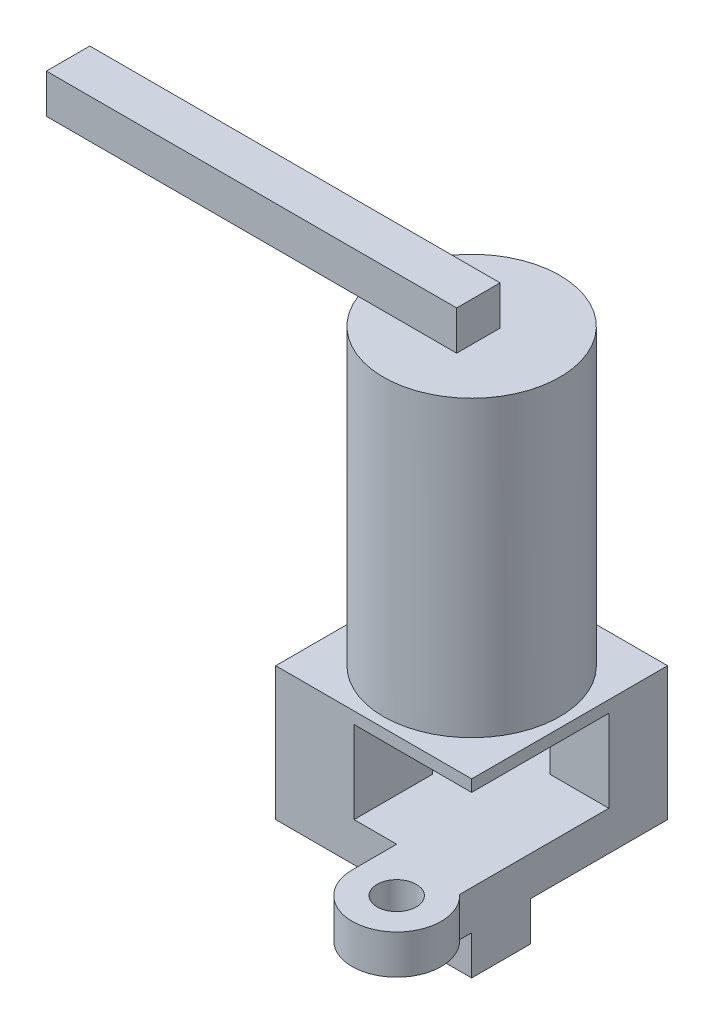
ISO-10303-21;
HEADER;
FILE_DESCRIPTION(('STEP AP214'),'2;1');
FILE_NAME('part.step','',(''),(''),'','','');
FILE_SCHEMA(('AUTOMOTIVE_DESIGN { 1 0 10303 214 1 1 1 1 }'));
ENDSEC;
DATA;
#1=APPLICATION_CONTEXT('core data for automotive mechanical design processes');
#2=APPLICATION_PROTOCOL_DEFINITION('international standard','automotive_design',2000,#1);
#3=PRODUCT_CONTEXT('',#1,'mechanical');
#4=PRODUCT('Part','Part','',(#3));
#5=PRODUCT_RELATED_PRODUCT_CATEGORY('part','',(#4));
#6=PRODUCT_DEFINITION_FORMATION('','',#4);
#7=PRODUCT_DEFINITION_CONTEXT('part definition',#1,'design');
#8=PRODUCT_DEFINITION('design','',#6,#7);
#9=PRODUCT_DEFINITION_SHAPE('','',#8);
#10=(LENGTH_UNIT() NAMED_UNIT(*) SI_UNIT(.MILLI.,.METRE.));
#11=(NAMED_UNIT(*) PLANE_ANGLE_UNIT() SI_UNIT($,.RADIAN.));
#12=(NAMED_UNIT(*) SI_UNIT($,.STERADIAN.) SOLID_ANGLE_UNIT());
#13=UNCERTAINTY_MEASURE_WITH_UNIT(LENGTH_MEASURE(1.E-05),#10,'distance_accuracy_value','');
#14=(GEOMETRIC_REPRESENTATION_CONTEXT(3) GLOBAL_UNCERTAINTY_ASSIGNED_CONTEXT((#13)) GLOBAL_UNIT_ASSIGNED_CONTEXT((#10,
#11,#12)) REPRESENTATION_CONTEXT('',''));
#15=CARTESIAN_POINT('',(0.,0.,0.));
#16=DIRECTION('',(0.,0.,1.));
#17=DIRECTION('',(1.,0.,0.));
#18=AXIS2_PLACEMENT_3D('',#15,#16,#17);
#19=CARTESIAN_POINT('',(42.2387696608268,10.,11.3627174683151));
#20=DIRECTION('',(0.,1.,0.));
#21=DIRECTION('',(0.,0.,1.));
#22=AXIS2_PLACEMENT_3D('',#19,#20,#21);
#23=PLANE('',#22);
#24=DIRECTION('',(0.723776357055051,0.,0.690034625919685));
#25=VECTOR('',#24,1.);
#26=CARTESIAN_POINT('',(3.43626604404177,10.,-40.4752499347023));
#27=LINE('',#26,#25);
#28=CARTESIAN_POINT('',(3.43626604404177,10.,-40.4752499347023));
#29=VERTEX_POINT('',#28);
#30=CARTESIAN_POINT('',(17.9342555580442,10.,-26.6531422168051));
#31=VERTEX_POINT('',#30);
#32=EDGE_CURVE('E380',#29,#31,#27,.T.);
#33=ORIENTED_EDGE('',*,*,#32,.F.);
#34=CARTESIAN_POINT('',(6.64626657364341,10.,-43.8422150146986));
#35=DIRECTION('',(0.,1.,0.));
#36=DIRECTION('',(0.,0.,1.));
#37=AXIS2_PLACEMENT_3D('',#34,#35,#36);
#38=CIRCLE('',#37,4.65194123457691);
#39=CARTESIAN_POINT('',(9.87465405870284,10.,-47.1915539787732));
#40=VERTEX_POINT('',#39);
#41=EDGE_CURVE('E378',#40,#29,#38,.T.);
#42=ORIENTED_EDGE('',*,*,#41,.F.);
#43=DIRECTION('',(-0.719987376276317,0.,-0.693987159825559));
#44=VECTOR('',#43,1.);
#45=CARTESIAN_POINT('',(9.87465405870284,10.,-47.1915539787732));
#46=LINE('',#45,#44);
#47=CARTESIAN_POINT('',(24.29674636625,10.,-33.2902729160126));
#48=VERTEX_POINT('',#47);
#49=EDGE_CURVE('E386',#48,#40,#46,.T.);
#50=ORIENTED_EDGE('',*,*,#49,.F.);
#51=CARTESIAN_POINT('',(21.1064158592592,10.,-29.9804167340048));
#52=DIRECTION('',(0.,1.,0.));
#53=DIRECTION('',(0.,0.,1.));
#54=AXIS2_PLACEMENT_3D('',#51,#52,#53);
#55=CIRCLE('',#54,4.5971030757871);
#56=EDGE_CURVE('E383',#31,#48,#55,.T.);
#57=ORIENTED_EDGE('',*,*,#56,.F.);
#58=EDGE_LOOP('',(#33,#42,#50,#57));
#59=FACE_BOUND('',#58,.T.);
#60=CARTESIAN_POINT('',(42.2387696608268,10.,11.3627174683151));
#61=DIRECTION('',(0.,1.,0.));
#62=DIRECTION('',(0.,0.,1.));
#63=AXIS2_PLACEMENT_3D('',#60,#61,#62);
#64=CIRCLE('',#63,5.);
#65=CARTESIAN_POINT('',(42.2387696608268,10.,16.3627174683151));
#66=VERTEX_POINT('',#65);
#67=EDGE_CURVE('E372',#66,#66,#64,.T.);
#68=ORIENTED_EDGE('',*,*,#67,.F.);
#69=EDGE_LOOP('',(#68));
#70=FACE_BOUND('',#69,.T.);
#71=DIRECTION('',(1.,0.,0.));
#72=VECTOR('',#71,1.);
#73=CARTESIAN_POINT('',(50.,10.,-35.));
#74=LINE('',#73,#72);
#75=CARTESIAN_POINT('',(35.,10.,-35.));
#76=VERTEX_POINT('',#75);
#77=CARTESIAN_POINT('',(50.,10.,-35.));
#78=VERTEX_POINT('',#77);
#79=EDGE_CURVE('E288',#76,#78,#74,.T.);
#80=ORIENTED_EDGE('',*,*,#79,.F.);
#81=DIRECTION('',(0.,0.,1.));
#82=VECTOR('',#81,1.);
#83=CARTESIAN_POINT('',(35.,10.,-50.));
#84=LINE('',#83,#82);
#85=CARTESIAN_POINT('',(35.,10.,-50.));
#86=VERTEX_POINT('',#85);
#87=EDGE_CURVE('E283',#86,#76,#84,.T.);
#88=ORIENTED_EDGE('',*,*,#87,.F.);
#89=DIRECTION('',(-1.,0.,0.));
#90=VECTOR('',#89,1.);
#91=CARTESIAN_POINT('',(0.,10.,-50.));
#92=LINE('',#91,#90);
#93=CARTESIAN_POINT('',(0.,10.,-50.));
#94=VERTEX_POINT('',#93);
#95=EDGE_CURVE('E420',#86,#94,#92,.T.);
#96=ORIENTED_EDGE('',*,*,#95,.T.);
#97=DIRECTION('',(0.,0.,1.));
#98=VECTOR('',#97,1.);
#99=CARTESIAN_POINT('',(0.,10.,0.));
#100=LINE('',#99,#98);
#101=CARTESIAN_POINT('',(0.,10.,-20.));
#102=VERTEX_POINT('',#101);
#103=EDGE_CURVE('E409',#94,#102,#100,.T.);
#104=ORIENTED_EDGE('',*,*,#103,.T.);
#105=DIRECTION('',(-1.,0.,0.));
#106=VECTOR('',#105,1.);
#107=CARTESIAN_POINT('',(0.,10.,-20.));
#108=LINE('',#107,#106);
#109=CARTESIAN_POINT('',(20.,10.,-20.));
#110=VERTEX_POINT('',#109);
#111=EDGE_CURVE('E309',#110,#102,#108,.T.);
#112=ORIENTED_EDGE('',*,*,#111,.F.);
#113=DIRECTION('',(0.,0.,-1.));
#114=VECTOR('',#113,1.);
#115=CARTESIAN_POINT('',(20.,10.,0.));
#116=LINE('',#115,#114);
#117=CARTESIAN_POINT('',(20.,10.,0.));
#118=VERTEX_POINT('',#117);
#119=EDGE_CURVE('E304',#118,#110,#116,.T.);
#120=ORIENTED_EDGE('',*,*,#119,.F.);
#121=DIRECTION('',(1.,0.,0.));
#122=VECTOR('',#121,1.);
#123=CARTESIAN_POINT('',(0.,10.,0.));
#124=LINE('',#123,#122);
#125=CARTESIAN_POINT('',(30.8760521925118,10.,0.));
#126=VERTEX_POINT('',#125);
#127=EDGE_CURVE('E411',#118,#126,#124,.T.);
#128=ORIENTED_EDGE('',*,*,#127,.T.);
#129=DIRECTION('',(0.,0.,1.));
#130=VECTOR('',#129,1.);
#131=CARTESIAN_POINT('',(30.8760521925118,10.,11.3627174683151));
#132=LINE('',#131,#130);
#133=CARTESIAN_POINT('',(30.8760521925118,10.,11.3627174683151));
#134=VERTEX_POINT('',#133);
#135=EDGE_CURVE('E414',#126,#134,#132,.T.);
#136=ORIENTED_EDGE('',*,*,#135,.T.);
#137=CARTESIAN_POINT('',(42.2387696608268,10.,11.3627174683151));
#138=DIRECTION('',(0.,1.,0.));
#139=DIRECTION('',(0.,0.,1.));
#140=AXIS2_PLACEMENT_3D('',#137,#138,#139);
#141=CIRCLE('',#140,11.3627174683151);
#142=CARTESIAN_POINT('',(50.,10.,3.06364210493568));
#143=VERTEX_POINT('',#142);
#144=EDGE_CURVE('E416',#134,#143,#141,.T.);
#145=ORIENTED_EDGE('',*,*,#144,.T.);
#146=DIRECTION('',(0.,0.,-1.));
#147=VECTOR('',#146,1.);
#148=CARTESIAN_POINT('',(50.,10.,0.));
#149=LINE('',#148,#147);
#150=EDGE_CURVE('E418',#143,#78,#149,.T.);
#151=ORIENTED_EDGE('',*,*,#150,.T.);
#152=EDGE_LOOP('',(#80,#88,#96,#104,#112,#120,#128,#136,#145,#151));
#153=FACE_BOUND('',#152,.T.);
#154=ADVANCED_FACE('F33',(#59,#70,#153),#23,.T.);
#155=CARTESIAN_POINT('',(42.2387696608268,0.,11.3627174683151));
#156=DIRECTION('',(0.,1.,0.));
#157=DIRECTION('',(0.,0.,1.));
#158=AXIS2_PLACEMENT_3D('',#155,#156,#157);
#159=PLANE('',#158);
#160=CARTESIAN_POINT('',(42.2387696608268,0.,11.3627174683151));
#161=DIRECTION('',(0.,1.,0.));
#162=DIRECTION('',(0.,0.,1.));
#163=AXIS2_PLACEMENT_3D('',#160,#161,#162);
#164=CIRCLE('',#163,5.);
#165=CARTESIAN_POINT('',(42.2387696608268,0.,16.3627174683151));
#166=VERTEX_POINT('',#165);
#167=EDGE_CURVE('E371',#166,#166,#164,.T.);
#168=ORIENTED_EDGE('',*,*,#167,.T.);
#169=EDGE_LOOP('',(#168));
#170=FACE_BOUND('',#169,.T.);
#171=CARTESIAN_POINT('',(6.64626657364341,0.,-43.8422150146986));
#172=DIRECTION('',(0.,1.,0.));
#173=DIRECTION('',(0.,0.,1.));
#174=AXIS2_PLACEMENT_3D('',#171,#172,#173);
#175=CIRCLE('',#174,4.65194123457691);
#176=CARTESIAN_POINT('',(9.87465405870284,0.,-47.1915539787733));
#177=VERTEX_POINT('',#176);
#178=CARTESIAN_POINT('',(3.43626604404177,0.,-40.4752499347023));
#179=VERTEX_POINT('',#178);
#180=EDGE_CURVE('E375',#177,#179,#175,.T.);
#181=ORIENTED_EDGE('',*,*,#180,.T.);
#182=DIRECTION('',(0.723776357055051,0.,0.690034625919685));
#183=VECTOR('',#182,1.);
#184=CARTESIAN_POINT('',(3.43626604404177,0.,-40.4752499347023));
#185=LINE('',#184,#183);
#186=CARTESIAN_POINT('',(17.9342555580442,0.,-26.6531422168051));
#187=VERTEX_POINT('',#186);
#188=EDGE_CURVE('E391',#179,#187,#185,.T.);
#189=ORIENTED_EDGE('',*,*,#188,.T.);
#190=CARTESIAN_POINT('',(21.1064158592592,0.,-29.9804167340048));
#191=DIRECTION('',(0.,1.,0.));
#192=DIRECTION('',(0.,0.,1.));
#193=AXIS2_PLACEMENT_3D('',#190,#191,#192);
#194=CIRCLE('',#193,4.5971030757871);
#195=CARTESIAN_POINT('',(24.29674636625,0.,-33.2902729160126));
#196=VERTEX_POINT('',#195);
#197=EDGE_CURVE('E394',#187,#196,#194,.T.);
#198=ORIENTED_EDGE('',*,*,#197,.T.);
#199=DIRECTION('',(-0.719987376276317,0.,-0.693987159825559));
#200=VECTOR('',#199,1.);
#201=CARTESIAN_POINT('',(9.87465405870284,0.,-47.1915539787732));
#202=LINE('',#201,#200);
#203=EDGE_CURVE('E381',#196,#177,#202,.T.);
#204=ORIENTED_EDGE('',*,*,#203,.T.);
#205=EDGE_LOOP('',(#181,#189,#198,#204));
#206=FACE_BOUND('',#205,.T.);
#207=DIRECTION('',(-1.,0.,0.));
#208=VECTOR('',#207,1.);
#209=CARTESIAN_POINT('',(50.,0.,0.));
#210=LINE('',#209,#208);
#211=CARTESIAN_POINT('',(50.,0.,0.));
#212=VERTEX_POINT('',#211);
#213=CARTESIAN_POINT('',(35.,0.,0.));
#214=VERTEX_POINT('',#213);
#215=EDGE_CURVE('E325',#212,#214,#210,.T.);
#216=ORIENTED_EDGE('',*,*,#215,.F.);
#217=DIRECTION('',(0.,0.,-1.));
#218=VECTOR('',#217,1.);
#219=CARTESIAN_POINT('',(50.,0.,0.));
#220=LINE('',#219,#218);
#221=CARTESIAN_POINT('',(50.,0.,3.06364210493568));
#222=VERTEX_POINT('',#221);
#223=EDGE_CURVE('E433',#222,#212,#220,.T.);
#224=ORIENTED_EDGE('',*,*,#223,.F.);
#225=CARTESIAN_POINT('',(42.2387696608268,0.,11.3627174683151));
#226=DIRECTION('',(0.,1.,0.));
#227=DIRECTION('',(0.,0.,1.));
#228=AXIS2_PLACEMENT_3D('',#225,#226,#227);
#229=CIRCLE('',#228,11.3627174683151);
#230=CARTESIAN_POINT('',(30.8760521925118,0.,11.3627174683151));
#231=VERTEX_POINT('',#230);
#232=EDGE_CURVE('E429',#231,#222,#229,.T.);
#233=ORIENTED_EDGE('',*,*,#232,.F.);
#234=DIRECTION('',(0.,0.,1.));
#235=VECTOR('',#234,1.);
#236=CARTESIAN_POINT('',(30.8760521925118,0.,11.3627174683151));
#237=LINE('',#236,#235);
#238=CARTESIAN_POINT('',(30.8760521925118,0.,0.));
#239=VERTEX_POINT('',#238);
#240=EDGE_CURVE('E427',#239,#231,#237,.T.);
#241=ORIENTED_EDGE('',*,*,#240,.F.);
#242=DIRECTION('',(1.,0.,0.));
#243=VECTOR('',#242,1.);
#244=CARTESIAN_POINT('',(0.,0.,0.));
#245=LINE('',#244,#243);
#246=CARTESIAN_POINT('',(0.,0.,0.));
#247=VERTEX_POINT('',#246);
#248=EDGE_CURVE('E425',#247,#239,#245,.T.);
#249=ORIENTED_EDGE('',*,*,#248,.F.);
#250=DIRECTION('',(0.,0.,1.));
#251=VECTOR('',#250,1.);
#252=CARTESIAN_POINT('',(0.,0.,0.));
#253=LINE('',#252,#251);
#254=CARTESIAN_POINT('',(0.,0.,-50.));
#255=VERTEX_POINT('',#254);
#256=EDGE_CURVE('E408',#255,#247,#253,.T.);
#257=ORIENTED_EDGE('',*,*,#256,.F.);
#258=DIRECTION('',(-1.,0.,0.));
#259=VECTOR('',#258,1.);
#260=CARTESIAN_POINT('',(0.,0.,-50.));
#261=LINE('',#260,#259);
#262=CARTESIAN_POINT('',(50.,0.,-50.));
#263=VERTEX_POINT('',#262);
#264=EDGE_CURVE('E412',#263,#255,#261,.T.);
#265=ORIENTED_EDGE('',*,*,#264,.F.);
#266=CARTESIAN_POINT('',(50.,0.,-15.));
#267=VERTEX_POINT('',#266);
#268=EDGE_CURVE('E432',#267,#263,#220,.T.);
#269=ORIENTED_EDGE('',*,*,#268,.F.);
#270=DIRECTION('',(1.,0.,0.));
#271=VECTOR('',#270,1.);
#272=CARTESIAN_POINT('',(50.,0.,-15.));
#273=LINE('',#272,#271);
#274=CARTESIAN_POINT('',(45.,0.,-15.));
#275=VERTEX_POINT('',#274);
#276=EDGE_CURVE('E330',#275,#267,#273,.T.);
#277=ORIENTED_EDGE('',*,*,#276,.F.);
#278=DIRECTION('',(0.,0.,-1.));
#279=VECTOR('',#278,1.);
#280=CARTESIAN_POINT('',(45.,0.,-5.));
#281=LINE('',#280,#279);
#282=CARTESIAN_POINT('',(45.,0.,-5.));
#283=VERTEX_POINT('',#282);
#284=EDGE_CURVE('E349',#283,#275,#281,.T.);
#285=ORIENTED_EDGE('',*,*,#284,.F.);
#286=DIRECTION('',(1.,0.,0.));
#287=VECTOR('',#286,1.);
#288=CARTESIAN_POINT('',(45.,0.,-5.));
#289=LINE('',#288,#287);
#290=CARTESIAN_POINT('',(35.,0.,-5.));
#291=VERTEX_POINT('',#290);
#292=EDGE_CURVE('E346',#291,#283,#289,.T.);
#293=ORIENTED_EDGE('',*,*,#292,.F.);
#294=DIRECTION('',(0.,0.,-1.));
#295=VECTOR('',#294,1.);
#296=CARTESIAN_POINT('',(35.,0.,0.));
#297=LINE('',#296,#295);
#298=EDGE_CURVE('E343',#214,#291,#297,.T.);
#299=ORIENTED_EDGE('',*,*,#298,.F.);
#300=EDGE_LOOP('',(#216,#224,#233,#241,#249,#257,#265,#269,#277,#285,#293,#299));
#301=FACE_BOUND('',#300,.T.);
#302=ADVANCED_FACE('F465',(#170,#206,#301),#159,.F.);
#303=CARTESIAN_POINT('',(0.,10.,0.));
#304=DIRECTION('',(1.,0.,0.));
#305=DIRECTION('',(0.,0.,-1.));
#306=AXIS2_PLACEMENT_3D('',#303,#304,#305);
#307=PLANE('',#306);
#308=ORIENTED_EDGE('',*,*,#256,.T.);
#309=DIRECTION('',(0.,-1.,0.));
#310=VECTOR('',#309,1.);
#311=CARTESIAN_POINT('',(0.,10.,0.));
#312=LINE('',#311,#310);
#313=CARTESIAN_POINT('',(0.,34.,0.));
#314=VERTEX_POINT('',#313);
#315=EDGE_CURVE('E37',#314,#247,#312,.T.);
#316=ORIENTED_EDGE('',*,*,#315,.F.);
#317=DIRECTION('',(0.,0.,1.));
#318=VECTOR('',#317,1.);
#319=CARTESIAN_POINT('',(0.,34.,0.));
#320=LINE('',#319,#318);
#321=CARTESIAN_POINT('',(0.,34.,-50.));
#322=VERTEX_POINT('',#321);
#323=EDGE_CURVE('E258',#322,#314,#320,.T.);
#324=ORIENTED_EDGE('',*,*,#323,.F.);
#325=DIRECTION('',(0.,-1.,0.));
#326=VECTOR('',#325,1.);
#327=CARTESIAN_POINT('',(0.,34.,-50.));
#328=LINE('',#327,#326);
#329=CARTESIAN_POINT('',(0.,31.,-50.));
#330=VERTEX_POINT('',#329);
#331=EDGE_CURVE('E269',#322,#330,#328,.T.);
#332=ORIENTED_EDGE('',*,*,#331,.T.);
#333=DIRECTION('',(0.,0.,1.));
#334=VECTOR('',#333,1.);
#335=CARTESIAN_POINT('',(0.,31.,0.));
#336=LINE('',#335,#334);
#337=CARTESIAN_POINT('',(0.,31.,-20.));
#338=VERTEX_POINT('',#337);
#339=EDGE_CURVE('E255',#330,#338,#336,.T.);
#340=ORIENTED_EDGE('',*,*,#339,.T.);
#341=DIRECTION('',(0.,-1.,0.));
#342=VECTOR('',#341,1.);
#343=CARTESIAN_POINT('',(0.,31.,-20.));
#344=LINE('',#343,#342);
#345=EDGE_CURVE('E312',#338,#102,#344,.T.);
#346=ORIENTED_EDGE('',*,*,#345,.T.);
#347=ORIENTED_EDGE('',*,*,#103,.F.);
#348=DIRECTION('',(0.,-1.,0.));
#349=VECTOR('',#348,1.);
#350=CARTESIAN_POINT('',(0.,10.,-50.));
#351=LINE('',#350,#349);
#352=EDGE_CURVE('E422',#94,#255,#351,.T.);
#353=ORIENTED_EDGE('',*,*,#352,.T.);
#354=EDGE_LOOP('',(#308,#316,#324,#332,#340,#346,#347,#353));
#355=FACE_BOUND('',#354,.T.);
#356=ADVANCED_FACE('F35',(#355),#307,.F.);
#357=CARTESIAN_POINT('',(0.,10.,0.));
#358=DIRECTION('',(0.,0.,-1.));
#359=DIRECTION('',(-1.,0.,0.));
#360=AXIS2_PLACEMENT_3D('',#357,#358,#359);
#361=PLANE('',#360);
#362=ORIENTED_EDGE('',*,*,#248,.T.);
#363=DIRECTION('',(0.,-1.,0.));
#364=VECTOR('',#363,1.);
#365=CARTESIAN_POINT('',(30.8760521925118,10.,0.));
#366=LINE('',#365,#364);
#367=EDGE_CURVE('E447',#126,#239,#366,.T.);
#368=ORIENTED_EDGE('',*,*,#367,.F.);
#369=ORIENTED_EDGE('',*,*,#127,.F.);
#370=DIRECTION('',(0.,-1.,0.));
#371=VECTOR('',#370,1.);
#372=CARTESIAN_POINT('',(20.,31.,0.));
#373=LINE('',#372,#371);
#374=CARTESIAN_POINT('',(20.,31.,0.));
#375=VERTEX_POINT('',#374);
#376=EDGE_CURVE('E322',#375,#118,#373,.T.);
#377=ORIENTED_EDGE('',*,*,#376,.F.);
#378=DIRECTION('',(1.,0.,0.));
#379=VECTOR('',#378,1.);
#380=CARTESIAN_POINT('',(0.,31.,0.));
#381=LINE('',#380,#379);
#382=CARTESIAN_POINT('',(50.,31.,0.));
#383=VERTEX_POINT('',#382);
#384=EDGE_CURVE('E272',#375,#383,#381,.T.);
#385=ORIENTED_EDGE('',*,*,#384,.T.);
#386=DIRECTION('',(0.,-1.,0.));
#387=VECTOR('',#386,1.);
#388=CARTESIAN_POINT('',(50.,34.,0.));
#389=LINE('',#388,#387);
#390=CARTESIAN_POINT('',(50.,34.,0.));
#391=VERTEX_POINT('',#390);
#392=EDGE_CURVE('E280',#391,#383,#389,.T.);
#393=ORIENTED_EDGE('',*,*,#392,.F.);
#394=DIRECTION('',(1.,0.,0.));
#395=VECTOR('',#394,1.);
#396=CARTESIAN_POINT('',(0.,34.,0.));
#397=LINE('',#396,#395);
#398=EDGE_CURVE('E261',#314,#391,#397,.T.);
#399=ORIENTED_EDGE('',*,*,#398,.F.);
#400=ORIENTED_EDGE('',*,*,#315,.T.);
#401=EDGE_LOOP('',(#362,#368,#369,#377,#385,#393,#399,#400));
#402=FACE_BOUND('',#401,.T.);
#403=ADVANCED_FACE('F456',(#402),#361,.F.);
#404=CARTESIAN_POINT('',(30.8760521925118,10.,11.3627174683151));
#405=DIRECTION('',(1.,0.,0.));
#406=DIRECTION('',(0.,0.,-1.));
#407=AXIS2_PLACEMENT_3D('',#404,#405,#406);
#408=PLANE('',#407);
#409=ORIENTED_EDGE('',*,*,#240,.T.);
#410=DIRECTION('',(0.,-1.,0.));
#411=VECTOR('',#410,1.);
#412=CARTESIAN_POINT('',(30.8760521925118,10.,11.3627174683151));
#413=LINE('',#412,#411);
#414=EDGE_CURVE('E445',#134,#231,#413,.T.);
#415=ORIENTED_EDGE('',*,*,#414,.F.);
#416=ORIENTED_EDGE('',*,*,#135,.F.);
#417=ORIENTED_EDGE('',*,*,#367,.T.);
#418=EDGE_LOOP('',(#409,#415,#416,#417));
#419=FACE_BOUND('',#418,.T.);
#420=ADVANCED_FACE('F468',(#419),#408,.F.);
#421=CARTESIAN_POINT('',(42.2387696608268,10.,11.3627174683151));
#422=DIRECTION('',(0.,-1.,0.));
#423=DIRECTION('',(0.,0.,-1.));
#424=AXIS2_PLACEMENT_3D('',#421,#422,#423);
#425=CYLINDRICAL_SURFACE('',#424,11.3627174683151);
#426=ORIENTED_EDGE('',*,*,#232,.T.);
#427=DIRECTION('',(0.,-1.,0.));
#428=VECTOR('',#427,1.);
#429=CARTESIAN_POINT('',(50.,10.,3.06364210493568));
#430=LINE('',#429,#428);
#431=EDGE_CURVE('E442',#143,#222,#430,.T.);
#432=ORIENTED_EDGE('',*,*,#431,.F.);
#433=ORIENTED_EDGE('',*,*,#144,.F.);
#434=ORIENTED_EDGE('',*,*,#414,.T.);
#435=EDGE_LOOP('',(#426,#432,#433,#434));
#436=FACE_BOUND('',#435,.T.);
#437=ADVANCED_FACE('F471',(#436),#425,.T.);
#438=CARTESIAN_POINT('',(50.,10.,0.));
#439=DIRECTION('',(-1.,0.,0.));
#440=DIRECTION('',(0.,0.,1.));
#441=AXIS2_PLACEMENT_3D('',#438,#439,#440);
#442=PLANE('',#441);
#443=ORIENTED_EDGE('',*,*,#223,.T.);
#444=DIRECTION('',(0.,1.,0.));
#445=VECTOR('',#444,1.);
#446=CARTESIAN_POINT('',(50.,-10.,0.));
#447=LINE('',#446,#445);
#448=CARTESIAN_POINT('',(50.,-10.,0.));
#449=VERTEX_POINT('',#448);
#450=EDGE_CURVE('E340',#449,#212,#447,.T.);
#451=ORIENTED_EDGE('',*,*,#450,.F.);
#452=DIRECTION('',(0.,0.,1.));
#453=VECTOR('',#452,1.);
#454=CARTESIAN_POINT('',(50.,-10.,-15.));
#455=LINE('',#454,#453);
#456=CARTESIAN_POINT('',(50.,-10.,-15.));
#457=VERTEX_POINT('',#456);
#458=EDGE_CURVE('E338',#457,#449,#455,.T.);
#459=ORIENTED_EDGE('',*,*,#458,.F.);
#460=DIRECTION('',(0.,1.,0.));
#461=VECTOR('',#460,1.);
#462=CARTESIAN_POINT('',(50.,-10.,-15.));
#463=LINE('',#462,#461);
#464=EDGE_CURVE('E356',#457,#267,#463,.T.);
#465=ORIENTED_EDGE('',*,*,#464,.T.);
#466=ORIENTED_EDGE('',*,*,#268,.T.);
#467=DIRECTION('',(0.,-1.,0.));
#468=VECTOR('',#467,1.);
#469=CARTESIAN_POINT('',(50.,10.,-50.));
#470=LINE('',#469,#468);
#471=CARTESIAN_POINT('',(50.,34.,-50.));
#472=VERTEX_POINT('',#471);
#473=EDGE_CURVE('E439',#472,#263,#470,.T.);
#474=ORIENTED_EDGE('',*,*,#473,.F.);
#475=DIRECTION('',(0.,0.,-1.));
#476=VECTOR('',#475,1.);
#477=CARTESIAN_POINT('',(50.,34.,0.));
#478=LINE('',#477,#476);
#479=EDGE_CURVE('E264',#391,#472,#478,.T.);
#480=ORIENTED_EDGE('',*,*,#479,.F.);
#481=ORIENTED_EDGE('',*,*,#392,.T.);
#482=DIRECTION('',(0.,0.,-1.));
#483=VECTOR('',#482,1.);
#484=CARTESIAN_POINT('',(50.,31.,0.));
#485=LINE('',#484,#483);
#486=CARTESIAN_POINT('',(50.,31.,-35.));
#487=VERTEX_POINT('',#486);
#488=EDGE_CURVE('E274',#383,#487,#485,.T.);
#489=ORIENTED_EDGE('',*,*,#488,.T.);
#490=DIRECTION('',(0.,-1.,0.));
#491=VECTOR('',#490,1.);
#492=CARTESIAN_POINT('',(50.,31.,-35.));
#493=LINE('',#492,#491);
#494=EDGE_CURVE('E291',#487,#78,#493,.T.);
#495=ORIENTED_EDGE('',*,*,#494,.T.);
#496=ORIENTED_EDGE('',*,*,#150,.F.);
#497=ORIENTED_EDGE('',*,*,#431,.T.);
#498=EDGE_LOOP('',(#443,#451,#459,#465,#466,#474,#480,#481,#489,#495,#496,#497));
#499=FACE_BOUND('',#498,.T.);
#500=ADVANCED_FACE('F486',(#499),#442,.F.);
#501=CARTESIAN_POINT('',(0.,10.,-50.));
#502=DIRECTION('',(0.,0.,1.));
#503=DIRECTION('',(1.,0.,0.));
#504=AXIS2_PLACEMENT_3D('',#501,#502,#503);
#505=PLANE('',#504);
#506=ORIENTED_EDGE('',*,*,#264,.T.);
#507=ORIENTED_EDGE('',*,*,#352,.F.);
#508=ORIENTED_EDGE('',*,*,#95,.F.);
#509=DIRECTION('',(0.,-1.,0.));
#510=VECTOR('',#509,1.);
#511=CARTESIAN_POINT('',(35.,31.,-50.));
#512=LINE('',#511,#510);
#513=CARTESIAN_POINT('',(35.,31.,-50.));
#514=VERTEX_POINT('',#513);
#515=EDGE_CURVE('E301',#514,#86,#512,.T.);
#516=ORIENTED_EDGE('',*,*,#515,.F.);
#517=DIRECTION('',(-1.,0.,0.));
#518=VECTOR('',#517,1.);
#519=CARTESIAN_POINT('',(0.,31.,-50.));
#520=LINE('',#519,#518);
#521=EDGE_CURVE('E262',#514,#330,#520,.T.);
#522=ORIENTED_EDGE('',*,*,#521,.T.);
#523=ORIENTED_EDGE('',*,*,#331,.F.);
#524=DIRECTION('',(-1.,0.,0.));
#525=VECTOR('',#524,1.);
#526=CARTESIAN_POINT('',(0.,34.,-50.));
#527=LINE('',#526,#525);
#528=EDGE_CURVE('E267',#472,#322,#527,.T.);
#529=ORIENTED_EDGE('',*,*,#528,.F.);
#530=ORIENTED_EDGE('',*,*,#473,.T.);
#531=EDGE_LOOP('',(#506,#507,#508,#516,#522,#523,#529,#530));
#532=FACE_BOUND('',#531,.T.);
#533=ADVANCED_FACE('F492',(#532),#505,.F.);
#534=CARTESIAN_POINT('',(6.64626657364341,10.,-43.8422150146986));
#535=DIRECTION('',(0.,-1.,0.));
#536=DIRECTION('',(0.,0.,-1.));
#537=AXIS2_PLACEMENT_3D('',#534,#535,#536);
#538=CYLINDRICAL_SURFACE('',#537,4.65194123457691);
#539=ORIENTED_EDGE('',*,*,#180,.F.);
#540=DIRECTION('',(0.,-1.,0.));
#541=VECTOR('',#540,1.);
#542=CARTESIAN_POINT('',(9.87465405870284,10.,-47.1915539787732));
#543=LINE('',#542,#541);
#544=EDGE_CURVE('E388',#40,#177,#543,.T.);
#545=ORIENTED_EDGE('',*,*,#544,.F.);
#546=ORIENTED_EDGE('',*,*,#41,.T.);
#547=DIRECTION('',(0.,-1.,0.));
#548=VECTOR('',#547,1.);
#549=CARTESIAN_POINT('',(3.43626604404177,10.,-40.4752499347023));
#550=LINE('',#549,#548);
#551=EDGE_CURVE('E405',#29,#179,#550,.T.);
#552=ORIENTED_EDGE('',*,*,#551,.T.);
#553=EDGE_LOOP('',(#539,#545,#546,#552));
#554=FACE_BOUND('',#553,.T.);
#555=ADVANCED_FACE('F547',(#554),#538,.F.);
#556=CARTESIAN_POINT('',(3.43626604404177,10.,-40.4752499347023));
#557=DIRECTION('',(0.690034625919685,0.,-0.723776357055051));
#558=DIRECTION('',(-0.723776357055051,0.,-0.690034625919685));
#559=AXIS2_PLACEMENT_3D('',#556,#557,#558);
#560=PLANE('',#559);
#561=ORIENTED_EDGE('',*,*,#188,.F.);
#562=ORIENTED_EDGE('',*,*,#551,.F.);
#563=ORIENTED_EDGE('',*,*,#32,.T.);
#564=DIRECTION('',(0.,-1.,0.));
#565=VECTOR('',#564,1.);
#566=CARTESIAN_POINT('',(17.9342555580442,10.,-26.6531422168051));
#567=LINE('',#566,#565);
#568=EDGE_CURVE('E403',#31,#187,#567,.T.);
#569=ORIENTED_EDGE('',*,*,#568,.T.);
#570=EDGE_LOOP('',(#561,#562,#563,#569));
#571=FACE_BOUND('',#570,.T.);
#572=ADVANCED_FACE('F825',(#571),#560,.T.);
#573=CARTESIAN_POINT('',(21.1064158592592,10.,-29.9804167340048));
#574=DIRECTION('',(0.,-1.,0.));
#575=DIRECTION('',(0.,0.,-1.));
#576=AXIS2_PLACEMENT_3D('',#573,#574,#575);
#577=CYLINDRICAL_SURFACE('',#576,4.5971030757871);
#578=ORIENTED_EDGE('',*,*,#197,.F.);
#579=ORIENTED_EDGE('',*,*,#568,.F.);
#580=ORIENTED_EDGE('',*,*,#56,.T.);
#581=DIRECTION('',(0.,-1.,0.));
#582=VECTOR('',#581,1.);
#583=CARTESIAN_POINT('',(24.29674636625,10.,-33.2902729160126));
#584=LINE('',#583,#582);
#585=EDGE_CURVE('E401',#48,#196,#584,.T.);
#586=ORIENTED_EDGE('',*,*,#585,.T.);
#587=EDGE_LOOP('',(#578,#579,#580,#586));
#588=FACE_BOUND('',#587,.T.);
#589=ADVANCED_FACE('F834',(#588),#577,.F.);
#590=CARTESIAN_POINT('',(9.87465405870284,10.,-47.1915539787732));
#591=DIRECTION('',(-0.693987159825559,0.,0.719987376276317));
#592=DIRECTION('',(0.719987376276317,0.,0.693987159825559));
#593=AXIS2_PLACEMENT_3D('',#590,#591,#592);
#594=PLANE('',#593);
#595=ORIENTED_EDGE('',*,*,#203,.F.);
#596=ORIENTED_EDGE('',*,*,#585,.F.);
#597=ORIENTED_EDGE('',*,*,#49,.T.);
#598=ORIENTED_EDGE('',*,*,#544,.T.);
#599=EDGE_LOOP('',(#595,#596,#597,#598));
#600=FACE_BOUND('',#599,.T.);
#601=ADVANCED_FACE('F842',(#600),#594,.T.);
#602=CARTESIAN_POINT('',(42.2387696608268,10.,11.3627174683151));
#603=DIRECTION('',(0.,-1.,0.));
#604=DIRECTION('',(0.,0.,-1.));
#605=AXIS2_PLACEMENT_3D('',#602,#603,#604);
#606=CYLINDRICAL_SURFACE('',#605,5.);
#607=ORIENTED_EDGE('',*,*,#67,.T.);
#608=EDGE_LOOP('',(#607));
#609=FACE_BOUND('',#608,.T.);
#610=ORIENTED_EDGE('',*,*,#167,.F.);
#611=EDGE_LOOP('',(#610));
#612=FACE_BOUND('',#611,.T.);
#613=ADVANCED_FACE('F534',(#609,#612),#606,.F.);
#614=CARTESIAN_POINT('',(50.,-10.,0.));
#615=DIRECTION('',(0.,0.,-1.));
#616=DIRECTION('',(-1.,0.,0.));
#617=AXIS2_PLACEMENT_3D('',#614,#615,#616);
#618=PLANE('',#617);
#619=ORIENTED_EDGE('',*,*,#215,.T.);
#620=DIRECTION('',(0.,1.,0.));
#621=VECTOR('',#620,1.);
#622=CARTESIAN_POINT('',(35.,-10.,0.));
#623=LINE('',#622,#621);
#624=CARTESIAN_POINT('',(35.,-10.,0.));
#625=VERTEX_POINT('',#624);
#626=EDGE_CURVE('E368',#625,#214,#623,.T.);
#627=ORIENTED_EDGE('',*,*,#626,.F.);
#628=DIRECTION('',(-1.,0.,0.));
#629=VECTOR('',#628,1.);
#630=CARTESIAN_POINT('',(50.,-10.,0.));
#631=LINE('',#630,#629);
#632=EDGE_CURVE('E326',#449,#625,#631,.T.);
#633=ORIENTED_EDGE('',*,*,#632,.F.);
#634=ORIENTED_EDGE('',*,*,#450,.T.);
#635=EDGE_LOOP('',(#619,#627,#633,#634));
#636=FACE_BOUND('',#635,.T.);
#637=ADVANCED_FACE('F508',(#636),#618,.F.);
#638=CARTESIAN_POINT('',(35.,-10.,0.));
#639=DIRECTION('',(1.,0.,0.));
#640=DIRECTION('',(0.,0.,-1.));
#641=AXIS2_PLACEMENT_3D('',#638,#639,#640);
#642=PLANE('',#641);
#643=ORIENTED_EDGE('',*,*,#298,.T.);
#644=DIRECTION('',(0.,1.,0.));
#645=VECTOR('',#644,1.);
#646=CARTESIAN_POINT('',(35.,-10.,-5.));
#647=LINE('',#646,#645);
#648=CARTESIAN_POINT('',(35.,-10.,-5.));
#649=VERTEX_POINT('',#648);
#650=EDGE_CURVE('E365',#649,#291,#647,.T.);
#651=ORIENTED_EDGE('',*,*,#650,.F.);
#652=DIRECTION('',(0.,0.,-1.));
#653=VECTOR('',#652,1.);
#654=CARTESIAN_POINT('',(35.,-10.,0.));
#655=LINE('',#654,#653);
#656=EDGE_CURVE('E329',#625,#649,#655,.T.);
#657=ORIENTED_EDGE('',*,*,#656,.F.);
#658=ORIENTED_EDGE('',*,*,#626,.T.);
#659=EDGE_LOOP('',(#643,#651,#657,#658));
#660=FACE_BOUND('',#659,.T.);
#661=ADVANCED_FACE('F526',(#660),#642,.F.);
#662=CARTESIAN_POINT('',(45.,-10.,-5.));
#663=DIRECTION('',(0.,0.,1.));
#664=DIRECTION('',(1.,0.,0.));
#665=AXIS2_PLACEMENT_3D('',#662,#663,#664);
#666=PLANE('',#665);
#667=ORIENTED_EDGE('',*,*,#292,.T.);
#668=DIRECTION('',(0.,1.,0.));
#669=VECTOR('',#668,1.);
#670=CARTESIAN_POINT('',(45.,-10.,-5.));
#671=LINE('',#670,#669);
#672=CARTESIAN_POINT('',(45.,-10.,-5.));
#673=VERTEX_POINT('',#672);
#674=EDGE_CURVE('E362',#673,#283,#671,.T.);
#675=ORIENTED_EDGE('',*,*,#674,.F.);
#676=DIRECTION('',(1.,0.,0.));
#677=VECTOR('',#676,1.);
#678=CARTESIAN_POINT('',(45.,-10.,-5.));
#679=LINE('',#678,#677);
#680=EDGE_CURVE('E332',#649,#673,#679,.T.);
#681=ORIENTED_EDGE('',*,*,#680,.F.);
#682=ORIENTED_EDGE('',*,*,#650,.T.);
#683=EDGE_LOOP('',(#667,#675,#681,#682));
#684=FACE_BOUND('',#683,.T.);
#685=ADVANCED_FACE('F524',(#684),#666,.F.);
#686=CARTESIAN_POINT('',(45.,-10.,-5.));
#687=DIRECTION('',(1.,0.,0.));
#688=DIRECTION('',(0.,0.,-1.));
#689=AXIS2_PLACEMENT_3D('',#686,#687,#688);
#690=PLANE('',#689);
#691=ORIENTED_EDGE('',*,*,#284,.T.);
#692=DIRECTION('',(0.,1.,0.));
#693=VECTOR('',#692,1.);
#694=CARTESIAN_POINT('',(45.,-10.,-15.));
#695=LINE('',#694,#693);
#696=CARTESIAN_POINT('',(45.,-10.,-15.));
#697=VERTEX_POINT('',#696);
#698=EDGE_CURVE('E359',#697,#275,#695,.T.);
#699=ORIENTED_EDGE('',*,*,#698,.F.);
#700=DIRECTION('',(0.,0.,-1.));
#701=VECTOR('',#700,1.);
#702=CARTESIAN_POINT('',(45.,-10.,-5.));
#703=LINE('',#702,#701);
#704=EDGE_CURVE('E334',#673,#697,#703,.T.);
#705=ORIENTED_EDGE('',*,*,#704,.F.);
#706=ORIENTED_EDGE('',*,*,#674,.T.);
#707=EDGE_LOOP('',(#691,#699,#705,#706));
#708=FACE_BOUND('',#707,.T.);
#709=ADVANCED_FACE('F519',(#708),#690,.F.);
#710=CARTESIAN_POINT('',(50.,-10.,-15.));
#711=DIRECTION('',(0.,0.,1.));
#712=DIRECTION('',(1.,0.,0.));
#713=AXIS2_PLACEMENT_3D('',#710,#711,#712);
#714=PLANE('',#713);
#715=ORIENTED_EDGE('',*,*,#276,.T.);
#716=ORIENTED_EDGE('',*,*,#464,.F.);
#717=DIRECTION('',(1.,0.,0.));
#718=VECTOR('',#717,1.);
#719=CARTESIAN_POINT('',(50.,-10.,-15.));
#720=LINE('',#719,#718);
#721=EDGE_CURVE('E336',#697,#457,#720,.T.);
#722=ORIENTED_EDGE('',*,*,#721,.F.);
#723=ORIENTED_EDGE('',*,*,#698,.T.);
#724=EDGE_LOOP('',(#715,#716,#722,#723));
#725=FACE_BOUND('',#724,.T.);
#726=ADVANCED_FACE('F516',(#725),#714,.F.);
#727=CARTESIAN_POINT('',(0.,-10.,0.));
#728=DIRECTION('',(0.,-1.,0.));
#729=DIRECTION('',(0.,0.,-1.));
#730=AXIS2_PLACEMENT_3D('',#727,#728,#729);
#731=PLANE('',#730);
#732=ORIENTED_EDGE('',*,*,#632,.T.);
#733=ORIENTED_EDGE('',*,*,#656,.T.);
#734=ORIENTED_EDGE('',*,*,#680,.T.);
#735=ORIENTED_EDGE('',*,*,#704,.T.);
#736=ORIENTED_EDGE('',*,*,#721,.T.);
#737=ORIENTED_EDGE('',*,*,#458,.T.);
#738=EDGE_LOOP('',(#732,#733,#734,#735,#736,#737));
#739=FACE_BOUND('',#738,.T.);
#740=ADVANCED_FACE('F511',(#739),#731,.T.);
#741=CARTESIAN_POINT('',(20.,31.,0.));
#742=DIRECTION('',(-1.,0.,0.));
#743=DIRECTION('',(0.,0.,1.));
#744=AXIS2_PLACEMENT_3D('',#741,#742,#743);
#745=PLANE('',#744);
#746=ORIENTED_EDGE('',*,*,#119,.T.);
#747=DIRECTION('',(0.,-1.,0.));
#748=VECTOR('',#747,1.);
#749=CARTESIAN_POINT('',(20.,31.,-20.));
#750=LINE('',#749,#748);
#751=CARTESIAN_POINT('',(20.,31.,-20.));
#752=VERTEX_POINT('',#751);
#753=EDGE_CURVE('E319',#752,#110,#750,.T.);
#754=ORIENTED_EDGE('',*,*,#753,.F.);
#755=DIRECTION('',(0.,0.,-1.));
#756=VECTOR('',#755,1.);
#757=CARTESIAN_POINT('',(20.,31.,0.));
#758=LINE('',#757,#756);
#759=EDGE_CURVE('E305',#375,#752,#758,.T.);
#760=ORIENTED_EDGE('',*,*,#759,.F.);
#761=ORIENTED_EDGE('',*,*,#376,.T.);
#762=EDGE_LOOP('',(#746,#754,#760,#761));
#763=FACE_BOUND('',#762,.T.);
#764=ADVANCED_FACE('F478',(#763),#745,.F.);
#765=CARTESIAN_POINT('',(0.,31.,-20.));
#766=DIRECTION('',(0.,0.,1.));
#767=DIRECTION('',(1.,0.,0.));
#768=AXIS2_PLACEMENT_3D('',#765,#766,#767);
#769=PLANE('',#768);
#770=ORIENTED_EDGE('',*,*,#111,.T.);
#771=ORIENTED_EDGE('',*,*,#345,.F.);
#772=DIRECTION('',(-1.,0.,0.));
#773=VECTOR('',#772,1.);
#774=CARTESIAN_POINT('',(0.,31.,-20.));
#775=LINE('',#774,#773);
#776=EDGE_CURVE('E308',#752,#338,#775,.T.);
#777=ORIENTED_EDGE('',*,*,#776,.F.);
#778=ORIENTED_EDGE('',*,*,#753,.T.);
#779=EDGE_LOOP('',(#770,#771,#777,#778));
#780=FACE_BOUND('',#779,.T.);
#781=ADVANCED_FACE('F496',(#780),#769,.F.);
#782=CARTESIAN_POINT('',(35.,31.,-50.));
#783=DIRECTION('',(1.,0.,0.));
#784=DIRECTION('',(0.,0.,-1.));
#785=AXIS2_PLACEMENT_3D('',#782,#783,#784);
#786=PLANE('',#785);
#787=ORIENTED_EDGE('',*,*,#87,.T.);
#788=DIRECTION('',(0.,-1.,0.));
#789=VECTOR('',#788,1.);
#790=CARTESIAN_POINT('',(35.,31.,-35.));
#791=LINE('',#790,#789);
#792=CARTESIAN_POINT('',(35.,31.,-35.));
#793=VERTEX_POINT('',#792);
#794=EDGE_CURVE('E298',#793,#76,#791,.T.);
#795=ORIENTED_EDGE('',*,*,#794,.F.);
#796=DIRECTION('',(0.,0.,1.));
#797=VECTOR('',#796,1.);
#798=CARTESIAN_POINT('',(35.,31.,-50.));
#799=LINE('',#798,#797);
#800=EDGE_CURVE('E284',#514,#793,#799,.T.);
#801=ORIENTED_EDGE('',*,*,#800,.F.);
#802=ORIENTED_EDGE('',*,*,#515,.T.);
#803=EDGE_LOOP('',(#787,#795,#801,#802));
#804=FACE_BOUND('',#803,.T.);
#805=ADVANCED_FACE('F500',(#804),#786,.F.);
#806=CARTESIAN_POINT('',(50.,31.,-35.));
#807=DIRECTION('',(0.,0.,-1.));
#808=DIRECTION('',(-1.,0.,0.));
#809=AXIS2_PLACEMENT_3D('',#806,#807,#808);
#810=PLANE('',#809);
#811=ORIENTED_EDGE('',*,*,#79,.T.);
#812=ORIENTED_EDGE('',*,*,#494,.F.);
#813=DIRECTION('',(1.,0.,0.));
#814=VECTOR('',#813,1.);
#815=CARTESIAN_POINT('',(50.,31.,-35.));
#816=LINE('',#815,#814);
#817=EDGE_CURVE('E287',#793,#487,#816,.T.);
#818=ORIENTED_EDGE('',*,*,#817,.F.);
#819=ORIENTED_EDGE('',*,*,#794,.T.);
#820=EDGE_LOOP('',(#811,#812,#818,#819));
#821=FACE_BOUND('',#820,.T.);
#822=ADVANCED_FACE('F503',(#821),#810,.F.);
#823=CARTESIAN_POINT('',(0.,34.,0.));
#824=DIRECTION('',(0.,-1.,0.));
#825=DIRECTION('',(0.,0.,-1.));
#826=AXIS2_PLACEMENT_3D('',#823,#824,#825);
#827=PLANE('',#826);
#828=CARTESIAN_POINT('',(25.,34.,-25.));
#829=DIRECTION('',(0.,1.,0.));
#830=DIRECTION('',(0.,0.,1.));
#831=AXIS2_PLACEMENT_3D('',#828,#829,#830);
#832=CIRCLE('',#831,22.5);
#833=CARTESIAN_POINT('',(25.,34.,-2.5));
#834=VERTEX_POINT('',#833);
#835=EDGE_CURVE('E42',#834,#834,#832,.T.);
#836=ORIENTED_EDGE('',*,*,#835,.F.);
#837=EDGE_LOOP('',(#836));
#838=FACE_BOUND('',#837,.T.);
#839=ORIENTED_EDGE('',*,*,#323,.T.);
#840=ORIENTED_EDGE('',*,*,#398,.T.);
#841=ORIENTED_EDGE('',*,*,#479,.T.);
#842=ORIENTED_EDGE('',*,*,#528,.T.);
#843=EDGE_LOOP('',(#839,#840,#841,#842));
#844=FACE_BOUND('',#843,.T.);
#845=ADVANCED_FACE('F489',(#838,#844),#827,.F.);
#846=CARTESIAN_POINT('',(0.,31.,0.));
#847=DIRECTION('',(0.,-1.,0.));
#848=DIRECTION('',(0.,0.,-1.));
#849=AXIS2_PLACEMENT_3D('',#846,#847,#848);
#850=PLANE('',#849);
#851=ORIENTED_EDGE('',*,*,#384,.F.);
#852=ORIENTED_EDGE('',*,*,#759,.T.);
#853=ORIENTED_EDGE('',*,*,#776,.T.);
#854=ORIENTED_EDGE('',*,*,#339,.F.);
#855=ORIENTED_EDGE('',*,*,#521,.F.);
#856=ORIENTED_EDGE('',*,*,#800,.T.);
#857=ORIENTED_EDGE('',*,*,#817,.T.);
#858=ORIENTED_EDGE('',*,*,#488,.F.);
#859=EDGE_LOOP('',(#851,#852,#853,#854,#855,#856,#857,#858));
#860=FACE_BOUND('',#859,.T.);
#861=ADVANCED_FACE('F483',(#860),#850,.T.);
#862=CARTESIAN_POINT('',(25.,109.,-25.));
#863=DIRECTION('',(0.,-1.,0.));
#864=DIRECTION('',(0.,0.,-1.));
#865=AXIS2_PLACEMENT_3D('',#862,#863,#864);
#866=CYLINDRICAL_SURFACE('',#865,22.5);
#867=CARTESIAN_POINT('',(25.,109.,-25.));
#868=DIRECTION('',(0.,1.,0.));
#869=DIRECTION('',(0.,0.,1.));
#870=AXIS2_PLACEMENT_3D('',#867,#868,#869);
#871=CIRCLE('',#870,22.5);
#872=CARTESIAN_POINT('',(2.73062225441562,109.,-28.2132249881499));
#873=VERTEX_POINT('',#872);
#874=CARTESIAN_POINT('',(3.9186512090949,109.,-17.1370022792701));
#875=VERTEX_POINT('',#874);
#876=EDGE_CURVE('E248',#873,#875,#871,.T.);
#877=ORIENTED_EDGE('',*,*,#876,.F.);
#878=EDGE_CURVE('E246',#875,#873,#871,.T.);
#879=ORIENTED_EDGE('',*,*,#878,.F.);
#880=EDGE_LOOP('',(#877,#879));
#881=FACE_BOUND('',#880,.T.);
#882=ORIENTED_EDGE('',*,*,#835,.T.);
#883=EDGE_LOOP('',(#882));
#884=FACE_BOUND('',#883,.T.);
#885=ADVANCED_FACE('F696',(#881,#884),#866,.T.);
#886=CARTESIAN_POINT('',(25.,109.,-25.));
#887=DIRECTION('',(0.,1.,0.));
#888=DIRECTION('',(0.,0.,1.));
#889=AXIS2_PLACEMENT_3D('',#886,#887,#888);
#890=PLANE('',#889);
#891=DIRECTION('',(1.,0.,0.));
#892=VECTOR('',#891,1.);
#893=CARTESIAN_POINT('',(29.0352153292188,109.,-17.1370022792701));
#894=LINE('',#893,#892);
#895=CARTESIAN_POINT('',(29.0352153292188,109.,-17.1370022792701));
#896=VERTEX_POINT('',#895);
#897=EDGE_CURVE('E11',#875,#896,#894,.T.);
#898=ORIENTED_EDGE('',*,*,#897,.F.);
#899=ORIENTED_EDGE('',*,*,#878,.T.);
#900=DIRECTION('',(-1.,0.,0.));
#901=VECTOR('',#900,1.);
#902=CARTESIAN_POINT('',(29.0352153292188,109.,-28.2132249881499));
#903=LINE('',#902,#901);
#904=CARTESIAN_POINT('',(29.0352153292188,109.,-28.2132249881499));
#905=VERTEX_POINT('',#904);
#906=EDGE_CURVE('E55',#905,#873,#903,.T.);
#907=ORIENTED_EDGE('',*,*,#906,.F.);
#908=DIRECTION('',(0.,0.,-1.));
#909=VECTOR('',#908,1.);
#910=CARTESIAN_POINT('',(29.0352153292188,109.,-17.1370022792701));
#911=LINE('',#910,#909);
#912=EDGE_CURVE('E51',#896,#905,#911,.T.);
#913=ORIENTED_EDGE('',*,*,#912,.F.);
#914=EDGE_LOOP('',(#898,#899,#907,#913));
#915=FACE_BOUND('',#914,.T.);
#916=ADVANCED_FACE('F712',(#915),#890,.T.);
#917=CARTESIAN_POINT('',(0.,109.,0.));
#918=DIRECTION('',(0.,1.,0.));
#919=DIRECTION('',(0.,0.,1.));
#920=AXIS2_PLACEMENT_3D('',#917,#918,#919);
#921=PLANE('',#920);
#922=CARTESIAN_POINT('',(-75.6385440161971,109.,-28.2132249881499));
#923=VERTEX_POINT('',#922);
#924=EDGE_CURVE('E792',#873,#923,#903,.T.);
#925=ORIENTED_EDGE('',*,*,#924,.F.);
#926=ORIENTED_EDGE('',*,*,#876,.T.);
#927=CARTESIAN_POINT('',(-75.6385440161971,109.,-17.1370022792701));
#928=VERTEX_POINT('',#927);
#929=EDGE_CURVE('E44',#928,#875,#894,.T.);
#930=ORIENTED_EDGE('',*,*,#929,.F.);
#931=DIRECTION('',(0.,0.,1.));
#932=VECTOR('',#931,1.);
#933=CARTESIAN_POINT('',(-75.6385440161971,109.,-17.1370022792701));
#934=LINE('',#933,#932);
#935=EDGE_CURVE('E784',#923,#928,#934,.T.);
#936=ORIENTED_EDGE('',*,*,#935,.F.);
#937=EDGE_LOOP('',(#925,#926,#930,#936));
#938=FACE_BOUND('',#937,.T.);
#939=ADVANCED_FACE('F722',(#938),#921,.F.);
#940=CARTESIAN_POINT('',(29.0352153292188,119.,-17.1370022792701));
#941=DIRECTION('',(-1.,0.,0.));
#942=DIRECTION('',(0.,0.,1.));
#943=AXIS2_PLACEMENT_3D('',#940,#941,#942);
#944=PLANE('',#943);
#945=ORIENTED_EDGE('',*,*,#912,.T.);
#946=DIRECTION('',(0.,-1.,0.));
#947=VECTOR('',#946,1.);
#948=CARTESIAN_POINT('',(29.0352153292188,119.,-28.2132249881499));
#949=LINE('',#948,#947);
#950=CARTESIAN_POINT('',(29.0352153292188,119.,-28.2132249881499));
#951=VERTEX_POINT('',#950);
#952=EDGE_CURVE('E229',#951,#905,#949,.T.);
#953=ORIENTED_EDGE('',*,*,#952,.F.);
#954=DIRECTION('',(0.,0.,-1.));
#955=VECTOR('',#954,1.);
#956=CARTESIAN_POINT('',(29.0352153292188,119.,-17.1370022792701));
#957=LINE('',#956,#955);
#958=CARTESIAN_POINT('',(29.0352153292188,119.,-17.1370022792701));
#959=VERTEX_POINT('',#958);
#960=EDGE_CURVE('E235',#959,#951,#957,.T.);
#961=ORIENTED_EDGE('',*,*,#960,.F.);
#962=DIRECTION('',(0.,-1.,0.));
#963=VECTOR('',#962,1.);
#964=CARTESIAN_POINT('',(29.0352153292188,119.,-17.1370022792701));
#965=LINE('',#964,#963);
#966=EDGE_CURVE('E788',#959,#896,#965,.T.);
#967=ORIENTED_EDGE('',*,*,#966,.T.);
#968=EDGE_LOOP('',(#945,#953,#961,#967));
#969=FACE_BOUND('',#968,.T.);
#970=ADVANCED_FACE('F245',(#969),#944,.F.);
#971=CARTESIAN_POINT('',(29.0352153292188,119.,-28.2132249881499));
#972=DIRECTION('',(0.,0.,1.));
#973=DIRECTION('',(1.,0.,0.));
#974=AXIS2_PLACEMENT_3D('',#971,#972,#973);
#975=PLANE('',#974);
#976=ORIENTED_EDGE('',*,*,#906,.T.);
#977=ORIENTED_EDGE('',*,*,#924,.T.);
#978=DIRECTION('',(0.,-1.,0.));
#979=VECTOR('',#978,1.);
#980=CARTESIAN_POINT('',(-75.6385440161971,119.,-28.2132249881499));
#981=LINE('',#980,#979);
#982=CARTESIAN_POINT('',(-75.6385440161971,119.,-28.2132249881499));
#983=VERTEX_POINT('',#982);
#984=EDGE_CURVE('E231',#983,#923,#981,.T.);
#985=ORIENTED_EDGE('',*,*,#984,.F.);
#986=DIRECTION('',(-1.,0.,0.));
#987=VECTOR('',#986,1.);
#988=CARTESIAN_POINT('',(29.0352153292188,119.,-28.2132249881499));
#989=LINE('',#988,#987);
#990=EDGE_CURVE('E225',#951,#983,#989,.T.);
#991=ORIENTED_EDGE('',*,*,#990,.F.);
#992=ORIENTED_EDGE('',*,*,#952,.T.);
#993=EDGE_LOOP('',(#976,#977,#985,#991,#992));
#994=FACE_BOUND('',#993,.T.);
#995=ADVANCED_FACE('F227',(#994),#975,.F.);
#996=CARTESIAN_POINT('',(-75.6385440161971,119.,-17.1370022792701));
#997=DIRECTION('',(1.,0.,0.));
#998=DIRECTION('',(0.,0.,-1.));
#999=AXIS2_PLACEMENT_3D('',#996,#997,#998);
#1000=PLANE('',#999);
#1001=ORIENTED_EDGE('',*,*,#935,.T.);
#1002=DIRECTION('',(0.,-1.,0.));
#1003=VECTOR('',#1002,1.);
#1004=CARTESIAN_POINT('',(-75.6385440161971,119.,-17.1370022792701));
#1005=LINE('',#1004,#1003);
#1006=CARTESIAN_POINT('',(-75.6385440161971,119.,-17.1370022792701));
#1007=VERTEX_POINT('',#1006);
#1008=EDGE_CURVE('E250',#1007,#928,#1005,.T.);
#1009=ORIENTED_EDGE('',*,*,#1008,.F.);
#1010=DIRECTION('',(0.,0.,1.));
#1011=VECTOR('',#1010,1.);
#1012=CARTESIAN_POINT('',(-75.6385440161971,119.,-17.1370022792701));
#1013=LINE('',#1012,#1011);
#1014=EDGE_CURVE('E234',#983,#1007,#1013,.T.);
#1015=ORIENTED_EDGE('',*,*,#1014,.F.);
#1016=ORIENTED_EDGE('',*,*,#984,.T.);
#1017=EDGE_LOOP('',(#1001,#1009,#1015,#1016));
#1018=FACE_BOUND('',#1017,.T.);
#1019=ADVANCED_FACE('F748',(#1018),#1000,.F.);
#1020=CARTESIAN_POINT('',(29.0352153292188,119.,-17.1370022792701));
#1021=DIRECTION('',(0.,0.,-1.));
#1022=DIRECTION('',(-1.,0.,0.));
#1023=AXIS2_PLACEMENT_3D('',#1020,#1021,#1022);
#1024=PLANE('',#1023);
#1025=ORIENTED_EDGE('',*,*,#929,.T.);
#1026=ORIENTED_EDGE('',*,*,#897,.T.);
#1027=ORIENTED_EDGE('',*,*,#966,.F.);
#1028=DIRECTION('',(1.,0.,0.));
#1029=VECTOR('',#1028,1.);
#1030=CARTESIAN_POINT('',(29.0352153292188,119.,-17.1370022792701));
#1031=LINE('',#1030,#1029);
#1032=EDGE_CURVE('E240',#1007,#959,#1031,.T.);
#1033=ORIENTED_EDGE('',*,*,#1032,.F.);
#1034=ORIENTED_EDGE('',*,*,#1008,.T.);
#1035=EDGE_LOOP('',(#1025,#1026,#1027,#1033,#1034));
#1036=FACE_BOUND('',#1035,.T.);
#1037=ADVANCED_FACE('F757',(#1036),#1024,.F.);
#1038=CARTESIAN_POINT('',(0.,119.,0.));
#1039=DIRECTION('',(0.,1.,0.));
#1040=DIRECTION('',(0.,0.,1.));
#1041=AXIS2_PLACEMENT_3D('',#1038,#1039,#1040);
#1042=PLANE('',#1041);
#1043=ORIENTED_EDGE('',*,*,#960,.T.);
#1044=ORIENTED_EDGE('',*,*,#990,.T.);
#1045=ORIENTED_EDGE('',*,*,#1014,.T.);
#1046=ORIENTED_EDGE('',*,*,#1032,.T.);
#1047=EDGE_LOOP('',(#1043,#1044,#1045,#1046));
#1048=FACE_BOUND('',#1047,.T.);
#1049=ADVANCED_FACE('F238',(#1048),#1042,.T.);
#1050=CLOSED_SHELL('',(#154,#302,#356,#403,#420,#437,#500,#533,#555,#572,#589,#601,#613,#637,
#661,#685,#709,#726,#740,#764,#781,#805,#822,#845,#861,#885,#916,#939,#970,#995,#1019,#1037,#1049));
#1051=MANIFOLD_SOLID_BREP('B2',#1050);
#1052=ADVANCED_BREP_SHAPE_REPRESENTATION('',(#18,#1051),#14);
#1053=SHAPE_DEFINITION_REPRESENTATION(#9,#1052);
ENDSEC;
END-ISO-10303-21;
